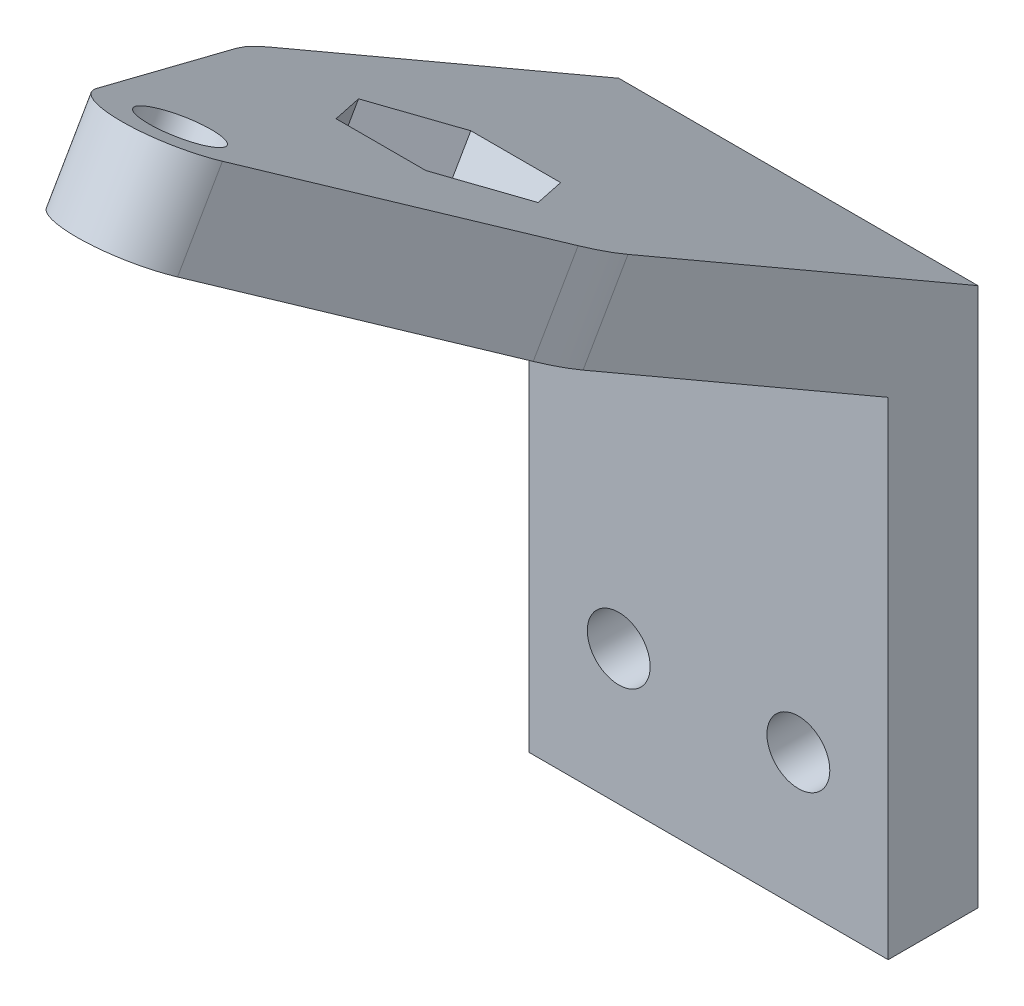
ISO-10303-21;
HEADER;
FILE_DESCRIPTION(('STEP AP214'),'2;1');
FILE_NAME('part.step','',(''),(''),'','','');
FILE_SCHEMA(('AUTOMOTIVE_DESIGN { 1 0 10303 214 1 1 1 1 }'));
ENDSEC;
DATA;
#1=APPLICATION_CONTEXT('core data for automotive mechanical design processes');
#2=APPLICATION_PROTOCOL_DEFINITION('international standard','automotive_design',2000,#1);
#3=PRODUCT_CONTEXT('',#1,'mechanical');
#4=PRODUCT('Part','Part','',(#3));
#5=PRODUCT_RELATED_PRODUCT_CATEGORY('part','',(#4));
#6=PRODUCT_DEFINITION_FORMATION('','',#4);
#7=PRODUCT_DEFINITION_CONTEXT('part definition',#1,'design');
#8=PRODUCT_DEFINITION('design','',#6,#7);
#9=PRODUCT_DEFINITION_SHAPE('','',#8);
#10=(LENGTH_UNIT() NAMED_UNIT(*) SI_UNIT(.MILLI.,.METRE.));
#11=(NAMED_UNIT(*) PLANE_ANGLE_UNIT() SI_UNIT($,.RADIAN.));
#12=(NAMED_UNIT(*) SI_UNIT($,.STERADIAN.) SOLID_ANGLE_UNIT());
#13=UNCERTAINTY_MEASURE_WITH_UNIT(LENGTH_MEASURE(1.E-05),#10,'distance_accuracy_value','');
#14=(GEOMETRIC_REPRESENTATION_CONTEXT(3) GLOBAL_UNCERTAINTY_ASSIGNED_CONTEXT((#13)) GLOBAL_UNIT_ASSIGNED_CONTEXT((#10,
#11,#12)) REPRESENTATION_CONTEXT('',''));
#15=CARTESIAN_POINT('',(0.,0.,0.));
#16=DIRECTION('',(0.,0.,1.));
#17=DIRECTION('',(1.,0.,0.));
#18=AXIS2_PLACEMENT_3D('',#15,#16,#17);
#19=CARTESIAN_POINT('',(-20.,0.,0.));
#20=DIRECTION('',(-1.,0.,0.));
#21=DIRECTION('',(0.,0.,1.));
#22=AXIS2_PLACEMENT_3D('',#19,#20,#21);
#23=PLANE('',#22);
#24=DIRECTION('',(0.,0.499999999999998,0.86602540378444));
#25=VECTOR('',#24,1.);
#26=CARTESIAN_POINT('',(-20.,-8.6602540378444,4.99999999999998));
#27=LINE('',#26,#25);
#28=CARTESIAN_POINT('',(-20.,-5.77350269189627,10.));
#29=VERTEX_POINT('',#28);
#30=CARTESIAN_POINT('',(-20.,13.8397459621555,43.9711431702998));
#31=VERTEX_POINT('',#30);
#32=EDGE_CURVE('E273',#29,#31,#27,.T.);
#33=ORIENTED_EDGE('',*,*,#32,.T.);
#34=DIRECTION('',(0.,0.86602540378444,-0.499999999999998));
#35=VECTOR('',#34,1.);
#36=CARTESIAN_POINT('',(-20.,13.8397459621555,43.9711431702998));
#37=LINE('',#36,#35);
#38=CARTESIAN_POINT('',(-20.,22.4999999999999,38.9711431702998));
#39=VERTEX_POINT('',#38);
#40=EDGE_CURVE('E229',#31,#39,#37,.T.);
#41=ORIENTED_EDGE('',*,*,#40,.T.);
#42=DIRECTION('',(0.,0.499999999999998,0.86602540378444));
#43=VECTOR('',#42,1.);
#44=CARTESIAN_POINT('',(-20.,0.,0.));
#45=LINE('',#44,#43);
#46=CARTESIAN_POINT('',(-20.,0.,0.));
#47=VERTEX_POINT('',#46);
#48=EDGE_CURVE('E246',#47,#39,#45,.T.);
#49=ORIENTED_EDGE('',*,*,#48,.F.);
#50=DIRECTION('',(0.,1.,0.));
#51=VECTOR('',#50,1.);
#52=CARTESIAN_POINT('',(-20.,-60.,0.));
#53=LINE('',#52,#51);
#54=CARTESIAN_POINT('',(-20.,-60.,0.));
#55=VERTEX_POINT('',#54);
#56=EDGE_CURVE('E259',#55,#47,#53,.T.);
#57=ORIENTED_EDGE('',*,*,#56,.F.);
#58=DIRECTION('',(0.,0.,1.));
#59=VECTOR('',#58,1.);
#60=CARTESIAN_POINT('',(-20.,-60.,0.));
#61=LINE('',#60,#59);
#62=CARTESIAN_POINT('',(-20.,-60.,10.));
#63=VERTEX_POINT('',#62);
#64=EDGE_CURVE('E279',#55,#63,#61,.T.);
#65=ORIENTED_EDGE('',*,*,#64,.T.);
#66=DIRECTION('',(0.,1.,0.));
#67=VECTOR('',#66,1.);
#68=CARTESIAN_POINT('',(-20.,-60.,10.));
#69=LINE('',#68,#67);
#70=EDGE_CURVE('E276',#63,#29,#69,.T.);
#71=ORIENTED_EDGE('',*,*,#70,.T.);
#72=EDGE_LOOP('',(#33,#41,#49,#57,#65,#71));
#73=FACE_BOUND('',#72,.T.);
#74=ADVANCED_FACE('F33',(#73),#23,.T.);
#75=CARTESIAN_POINT('',(20.,0.,0.));
#76=DIRECTION('',(0.,-0.86602540378444,0.499999999999998));
#77=DIRECTION('',(0.,-0.499999999999998,-0.86602540378444));
#78=AXIS2_PLACEMENT_3D('',#75,#76,#77);
#79=PLANE('',#78);
#80=CARTESIAN_POINT('',(0.,39.7499999999998,68.8490196008628));
#81=DIRECTION('',(0.,0.86602540378444,-0.499999999999998));
#82=DIRECTION('',(0.,0.499999999999998,0.86602540378444));
#83=AXIS2_PLACEMENT_3D('',#80,#81,#82);
#84=CIRCLE('',#83,4.);
#85=CARTESIAN_POINT('',(0.,41.7499999999998,72.3131212160006));
#86=VERTEX_POINT('',#85);
#87=EDGE_CURVE('E170',#86,#86,#84,.T.);
#88=ORIENTED_EDGE('',*,*,#87,.F.);
#89=EDGE_LOOP('',(#88));
#90=FACE_BOUND('',#89,.T.);
#91=DIRECTION('',(-0.5,-0.433012701892218,-0.750000000000001));
#92=VECTOR('',#91,1.);
#93=CARTESIAN_POINT('',(10.,22.4999999999999,38.9711431702998));
#94=LINE('',#93,#92);
#95=CARTESIAN_POINT('',(10.,22.4999999999999,38.9711431702998));
#96=VERTEX_POINT('',#95);
#97=CARTESIAN_POINT('',(5.00000000000001,18.1698729810777,31.4711431702998));
#98=VERTEX_POINT('',#97);
#99=EDGE_CURVE('E181',#96,#98,#94,.T.);
#100=ORIENTED_EDGE('',*,*,#99,.F.);
#101=DIRECTION('',(0.499999999999999,-0.433012701892218,-0.750000000000002));
#102=VECTOR('',#101,1.);
#103=CARTESIAN_POINT('',(5.00000000000002,26.8301270189221,46.4711431702998));
#104=LINE('',#103,#102);
#105=CARTESIAN_POINT('',(5.00000000000002,26.8301270189221,46.4711431702998));
#106=VERTEX_POINT('',#105);
#107=EDGE_CURVE('E48',#106,#96,#104,.T.);
#108=ORIENTED_EDGE('',*,*,#107,.F.);
#109=DIRECTION('',(1.,0.,0.));
#110=VECTOR('',#109,1.);
#111=CARTESIAN_POINT('',(-5.,26.8301270189221,46.4711431702998));
#112=LINE('',#111,#110);
#113=CARTESIAN_POINT('',(-5.,26.8301270189221,46.4711431702998));
#114=VERTEX_POINT('',#113);
#115=EDGE_CURVE('E164',#114,#106,#112,.T.);
#116=ORIENTED_EDGE('',*,*,#115,.F.);
#117=DIRECTION('',(0.5,0.433012701892218,0.750000000000001));
#118=VECTOR('',#117,1.);
#119=CARTESIAN_POINT('',(-10.,22.4999999999999,38.9711431702998));
#120=LINE('',#119,#118);
#121=CARTESIAN_POINT('',(-10.,22.4999999999999,38.9711431702998));
#122=VERTEX_POINT('',#121);
#123=EDGE_CURVE('E167',#122,#114,#120,.T.);
#124=ORIENTED_EDGE('',*,*,#123,.F.);
#125=DIRECTION('',(-0.5,0.433012701892218,0.750000000000001));
#126=VECTOR('',#125,1.);
#127=CARTESIAN_POINT('',(-5.00000000000001,18.1698729810777,31.4711431702998));
#128=LINE('',#127,#126);
#129=CARTESIAN_POINT('',(-5.00000000000001,18.1698729810777,31.4711431702998));
#130=VERTEX_POINT('',#129);
#131=EDGE_CURVE('E186',#130,#122,#128,.T.);
#132=ORIENTED_EDGE('',*,*,#131,.F.);
#133=DIRECTION('',(-1.,0.,0.));
#134=VECTOR('',#133,1.);
#135=CARTESIAN_POINT('',(5.00000000000001,18.1698729810777,31.4711431702998));
#136=LINE('',#135,#134);
#137=EDGE_CURVE('E183',#98,#130,#136,.T.);
#138=ORIENTED_EDGE('',*,*,#137,.F.);
#139=EDGE_LOOP('',(#100,#108,#116,#124,#132,#138));
#140=FACE_BOUND('',#139,.T.);
#141=CARTESIAN_POINT('',(-5.,22.4999999999999,38.9711431702998));
#142=DIRECTION('',(0.,0.86602540378444,-0.499999999999998));
#143=DIRECTION('',(0.,0.499999999999998,0.86602540378444));
#144=AXIS2_PLACEMENT_3D('',#141,#142,#143);
#145=CIRCLE('',#144,15.);
#146=CARTESIAN_POINT('',(-19.0344094541193,25.1474209749361,43.5566108079128));
#147=VERTEX_POINT('',#146);
#148=EDGE_CURVE('E204',#39,#147,#145,.T.);
#149=ORIENTED_EDGE('',*,*,#148,.T.);
#150=DIRECTION('',(0.352989463324824,0.46781364847064,0.810277007625319));
#151=VECTOR('',#150,1.);
#152=CARTESIAN_POINT('',(-33.2733976318987,6.27662254589737,10.8714291494266));
#153=LINE('',#152,#151);
#154=CARTESIAN_POINT('',(-7.01720472705962,41.0737104874679,71.1417534196695));
#155=VERTEX_POINT('',#154);
#156=EDGE_CURVE('E224',#147,#155,#153,.T.);
#157=ORIENTED_EDGE('',*,*,#156,.T.);
#158=CARTESIAN_POINT('',(0.,39.7499999999998,68.8490196008628));
#159=DIRECTION('',(0.,0.86602540378444,-0.499999999999998));
#160=DIRECTION('',(0.,0.499999999999998,0.86602540378444));
#161=AXIS2_PLACEMENT_3D('',#158,#159,#160);
#162=CIRCLE('',#161,7.50000000000004);
#163=CARTESIAN_POINT('',(7.01720472705962,41.0737104874679,71.1417534196695));
#164=VERTEX_POINT('',#163);
#165=EDGE_CURVE('E222',#155,#164,#162,.T.);
#166=ORIENTED_EDGE('',*,*,#165,.T.);
#167=DIRECTION('',(-0.352989463324824,0.46781364847064,0.810277007625319));
#168=VECTOR('',#167,1.);
#169=CARTESIAN_POINT('',(33.2733976318987,6.27662254589737,10.8714291494266));
#170=LINE('',#169,#168);
#171=CARTESIAN_POINT('',(19.0344094541193,25.1474209749361,43.5566108079128));
#172=VERTEX_POINT('',#171);
#173=EDGE_CURVE('E218',#172,#164,#170,.T.);
#174=ORIENTED_EDGE('',*,*,#173,.F.);
#175=CARTESIAN_POINT('',(5.,22.4999999999999,38.9711431702998));
#176=DIRECTION('',(0.,0.86602540378444,-0.499999999999998));
#177=DIRECTION('',(0.,0.499999999999998,0.86602540378444));
#178=AXIS2_PLACEMENT_3D('',#175,#176,#177);
#179=CIRCLE('',#178,15.);
#180=CARTESIAN_POINT('',(20.,22.4999999999999,38.9711431702998));
#181=VERTEX_POINT('',#180);
#182=EDGE_CURVE('E215',#181,#172,#179,.F.);
#183=ORIENTED_EDGE('',*,*,#182,.F.);
#184=DIRECTION('',(0.,0.499999999999998,0.86602540378444));
#185=VECTOR('',#184,1.);
#186=CARTESIAN_POINT('',(20.,0.,0.));
#187=LINE('',#186,#185);
#188=CARTESIAN_POINT('',(20.,0.,0.));
#189=VERTEX_POINT('',#188);
#190=EDGE_CURVE('E255',#189,#181,#187,.T.);
#191=ORIENTED_EDGE('',*,*,#190,.F.);
#192=DIRECTION('',(-1.,0.,0.));
#193=VECTOR('',#192,1.);
#194=CARTESIAN_POINT('',(20.,0.,0.));
#195=LINE('',#194,#193);
#196=EDGE_CURVE('E270',#189,#47,#195,.T.);
#197=ORIENTED_EDGE('',*,*,#196,.T.);
#198=ORIENTED_EDGE('',*,*,#48,.T.);
#199=EDGE_LOOP('',(#149,#157,#166,#174,#183,#191,#197,#198));
#200=FACE_BOUND('',#199,.T.);
#201=ADVANCED_FACE('F35',(#90,#140,#200),#79,.F.);
#202=CARTESIAN_POINT('',(20.,-8.6602540378444,4.99999999999998));
#203=DIRECTION('',(0.,-0.86602540378444,0.499999999999998));
#204=DIRECTION('',(0.,-0.499999999999998,-0.86602540378444));
#205=AXIS2_PLACEMENT_3D('',#202,#203,#204);
#206=PLANE('',#205);
#207=CARTESIAN_POINT('',(0.,31.0897459621554,73.8490196008628));
#208=DIRECTION('',(0.,0.86602540378444,-0.499999999999998));
#209=DIRECTION('',(0.,0.499999999999998,0.86602540378444));
#210=AXIS2_PLACEMENT_3D('',#207,#208,#209);
#211=CIRCLE('',#210,4.);
#212=CARTESIAN_POINT('',(0.,33.0897459621554,77.3131212160006));
#213=VERTEX_POINT('',#212);
#214=EDGE_CURVE('E219',#213,#213,#211,.T.);
#215=ORIENTED_EDGE('',*,*,#214,.T.);
#216=EDGE_LOOP('',(#215));
#217=FACE_BOUND('',#216,.T.);
#218=DIRECTION('',(0.499999999999999,-0.433012701892218,-0.750000000000002));
#219=VECTOR('',#218,1.);
#220=CARTESIAN_POINT('',(5.00000000000002,18.1698729810777,51.4711431702998));
#221=LINE('',#220,#219);
#222=CARTESIAN_POINT('',(5.00000000000002,18.1698729810777,51.4711431702998));
#223=VERTEX_POINT('',#222);
#224=CARTESIAN_POINT('',(10.,13.8397459621555,43.9711431702998));
#225=VERTEX_POINT('',#224);
#226=EDGE_CURVE('E147',#223,#225,#221,.T.);
#227=ORIENTED_EDGE('',*,*,#226,.T.);
#228=DIRECTION('',(-0.5,-0.433012701892218,-0.750000000000001));
#229=VECTOR('',#228,1.);
#230=CARTESIAN_POINT('',(10.,13.8397459621555,43.9711431702998));
#231=LINE('',#230,#229);
#232=CARTESIAN_POINT('',(5.00000000000001,9.50961894323332,36.4711431702997));
#233=VERTEX_POINT('',#232);
#234=EDGE_CURVE('E156',#225,#233,#231,.T.);
#235=ORIENTED_EDGE('',*,*,#234,.T.);
#236=DIRECTION('',(-1.,0.,0.));
#237=VECTOR('',#236,1.);
#238=CARTESIAN_POINT('',(5.00000000000001,9.50961894323333,36.4711431702997));
#239=LINE('',#238,#237);
#240=CARTESIAN_POINT('',(-5.00000000000001,9.50961894323333,36.4711431702997));
#241=VERTEX_POINT('',#240);
#242=EDGE_CURVE('E56',#233,#241,#239,.T.);
#243=ORIENTED_EDGE('',*,*,#242,.T.);
#244=DIRECTION('',(-0.5,0.433012701892218,0.750000000000001));
#245=VECTOR('',#244,1.);
#246=CARTESIAN_POINT('',(-5.00000000000001,9.50961894323333,36.4711431702997));
#247=LINE('',#246,#245);
#248=CARTESIAN_POINT('',(-10.,13.8397459621555,43.9711431702998));
#249=VERTEX_POINT('',#248);
#250=EDGE_CURVE('E174',#241,#249,#247,.T.);
#251=ORIENTED_EDGE('',*,*,#250,.T.);
#252=DIRECTION('',(0.5,0.433012701892218,0.750000000000001));
#253=VECTOR('',#252,1.);
#254=CARTESIAN_POINT('',(-10.,13.8397459621555,43.9711431702998));
#255=LINE('',#254,#253);
#256=CARTESIAN_POINT('',(-5.,18.1698729810777,51.4711431702998));
#257=VERTEX_POINT('',#256);
#258=EDGE_CURVE('E177',#249,#257,#255,.T.);
#259=ORIENTED_EDGE('',*,*,#258,.T.);
#260=DIRECTION('',(1.,0.,0.));
#261=VECTOR('',#260,1.);
#262=CARTESIAN_POINT('',(-5.,18.1698729810777,51.4711431702998));
#263=LINE('',#262,#261);
#264=EDGE_CURVE('E153',#257,#223,#263,.T.);
#265=ORIENTED_EDGE('',*,*,#264,.T.);
#266=EDGE_LOOP('',(#227,#235,#243,#251,#259,#265));
#267=FACE_BOUND('',#266,.T.);
#268=DIRECTION('',(0.352989463324824,0.46781364847064,0.810277007625319));
#269=VECTOR('',#268,1.);
#270=CARTESIAN_POINT('',(-33.2733976318987,-2.38363149194703,15.8714291494266));
#271=LINE('',#270,#269);
#272=CARTESIAN_POINT('',(-19.0344094541193,16.4871669370917,48.5566108079128));
#273=VERTEX_POINT('',#272);
#274=CARTESIAN_POINT('',(-7.01720472705962,32.4134564496235,76.1417534196695));
#275=VERTEX_POINT('',#274);
#276=EDGE_CURVE('E209',#273,#275,#271,.T.);
#277=ORIENTED_EDGE('',*,*,#276,.F.);
#278=CARTESIAN_POINT('',(-5.,13.8397459621555,43.9711431702998));
#279=DIRECTION('',(0.,0.86602540378444,-0.499999999999998));
#280=DIRECTION('',(0.,0.499999999999998,0.86602540378444));
#281=AXIS2_PLACEMENT_3D('',#278,#279,#280);
#282=CIRCLE('',#281,15.);
#283=EDGE_CURVE('E212',#31,#273,#282,.T.);
#284=ORIENTED_EDGE('',*,*,#283,.F.);
#285=ORIENTED_EDGE('',*,*,#32,.F.);
#286=DIRECTION('',(-1.,0.,0.));
#287=VECTOR('',#286,1.);
#288=CARTESIAN_POINT('',(20.,-5.77350269189627,10.));
#289=LINE('',#288,#287);
#290=CARTESIAN_POINT('',(20.,-5.77350269189627,10.));
#291=VERTEX_POINT('',#290);
#292=EDGE_CURVE('E11',#291,#29,#289,.T.);
#293=ORIENTED_EDGE('',*,*,#292,.F.);
#294=DIRECTION('',(0.,0.499999999999998,0.86602540378444));
#295=VECTOR('',#294,1.);
#296=CARTESIAN_POINT('',(20.,-8.6602540378444,4.99999999999998));
#297=LINE('',#296,#295);
#298=CARTESIAN_POINT('',(20.,13.8397459621555,43.9711431702998));
#299=VERTEX_POINT('',#298);
#300=EDGE_CURVE('E258',#291,#299,#297,.T.);
#301=ORIENTED_EDGE('',*,*,#300,.T.);
#302=CARTESIAN_POINT('',(5.,13.8397459621555,43.9711431702998));
#303=DIRECTION('',(0.,0.86602540378444,-0.499999999999998));
#304=DIRECTION('',(0.,0.499999999999998,0.86602540378444));
#305=AXIS2_PLACEMENT_3D('',#302,#303,#304);
#306=CIRCLE('',#305,15.);
#307=CARTESIAN_POINT('',(19.0344094541193,16.4871669370917,48.5566108079128));
#308=VERTEX_POINT('',#307);
#309=EDGE_CURVE('E200',#299,#308,#306,.F.);
#310=ORIENTED_EDGE('',*,*,#309,.T.);
#311=DIRECTION('',(-0.352989463324824,0.46781364847064,0.810277007625319));
#312=VECTOR('',#311,1.);
#313=CARTESIAN_POINT('',(33.2733976318987,-2.38363149194703,15.8714291494266));
#314=LINE('',#313,#312);
#315=CARTESIAN_POINT('',(7.01720472705962,32.4134564496235,76.1417534196695));
#316=VERTEX_POINT('',#315);
#317=EDGE_CURVE('E203',#308,#316,#314,.T.);
#318=ORIENTED_EDGE('',*,*,#317,.T.);
#319=CARTESIAN_POINT('',(0.,31.0897459621554,73.8490196008628));
#320=DIRECTION('',(0.,0.86602540378444,-0.499999999999998));
#321=DIRECTION('',(0.,0.499999999999998,0.86602540378444));
#322=AXIS2_PLACEMENT_3D('',#319,#320,#321);
#323=CIRCLE('',#322,7.50000000000004);
#324=EDGE_CURVE('E207',#275,#316,#323,.T.);
#325=ORIENTED_EDGE('',*,*,#324,.F.);
#326=EDGE_LOOP('',(#277,#284,#285,#293,#301,#310,#318,#325));
#327=FACE_BOUND('',#326,.T.);
#328=ADVANCED_FACE('F160',(#217,#267,#327),#206,.T.);
#329=CARTESIAN_POINT('',(20.,-60.,10.));
#330=DIRECTION('',(0.,0.,1.));
#331=DIRECTION('',(1.,0.,0.));
#332=AXIS2_PLACEMENT_3D('',#329,#330,#331);
#333=PLANE('',#332);
#334=CARTESIAN_POINT('',(10.,-45.,9.99999999999999));
#335=DIRECTION('',(0.,0.,1.));
#336=DIRECTION('',(1.,0.,0.));
#337=AXIS2_PLACEMENT_3D('',#334,#335,#336);
#338=CIRCLE('',#337,3.5);
#339=CARTESIAN_POINT('',(13.5,-45.,9.99999999999999));
#340=VERTEX_POINT('',#339);
#341=EDGE_CURVE('E247',#340,#340,#338,.F.);
#342=ORIENTED_EDGE('',*,*,#341,.T.);
#343=EDGE_LOOP('',(#342));
#344=FACE_BOUND('',#343,.T.);
#345=CARTESIAN_POINT('',(-10.,-45.,9.99999999999999));
#346=DIRECTION('',(0.,0.,1.));
#347=DIRECTION('',(1.,0.,0.));
#348=AXIS2_PLACEMENT_3D('',#345,#346,#347);
#349=CIRCLE('',#348,3.5);
#350=CARTESIAN_POINT('',(-6.5,-45.,9.99999999999999));
#351=VERTEX_POINT('',#350);
#352=EDGE_CURVE('E232',#351,#351,#349,.F.);
#353=ORIENTED_EDGE('',*,*,#352,.T.);
#354=EDGE_LOOP('',(#353));
#355=FACE_BOUND('',#354,.T.);
#356=ORIENTED_EDGE('',*,*,#70,.F.);
#357=DIRECTION('',(-1.,0.,0.));
#358=VECTOR('',#357,1.);
#359=CARTESIAN_POINT('',(20.,-60.,10.));
#360=LINE('',#359,#358);
#361=CARTESIAN_POINT('',(20.,-60.,10.));
#362=VERTEX_POINT('',#361);
#363=EDGE_CURVE('E41',#362,#63,#360,.T.);
#364=ORIENTED_EDGE('',*,*,#363,.F.);
#365=DIRECTION('',(0.,1.,0.));
#366=VECTOR('',#365,1.);
#367=CARTESIAN_POINT('',(20.,-60.,10.));
#368=LINE('',#367,#366);
#369=EDGE_CURVE('E262',#362,#291,#368,.T.);
#370=ORIENTED_EDGE('',*,*,#369,.T.);
#371=ORIENTED_EDGE('',*,*,#292,.T.);
#372=EDGE_LOOP('',(#356,#364,#370,#371));
#373=FACE_BOUND('',#372,.T.);
#374=ADVANCED_FACE('F293',(#344,#355,#373),#333,.T.);
#375=CARTESIAN_POINT('',(20.,-60.,0.));
#376=DIRECTION('',(0.,-1.,0.));
#377=DIRECTION('',(0.,0.,-1.));
#378=AXIS2_PLACEMENT_3D('',#375,#376,#377);
#379=PLANE('',#378);
#380=ORIENTED_EDGE('',*,*,#64,.F.);
#381=DIRECTION('',(-1.,0.,0.));
#382=VECTOR('',#381,1.);
#383=CARTESIAN_POINT('',(20.,-60.,0.));
#384=LINE('',#383,#382);
#385=CARTESIAN_POINT('',(20.,-60.,0.));
#386=VERTEX_POINT('',#385);
#387=EDGE_CURVE('E285',#386,#55,#384,.T.);
#388=ORIENTED_EDGE('',*,*,#387,.F.);
#389=DIRECTION('',(0.,0.,1.));
#390=VECTOR('',#389,1.);
#391=CARTESIAN_POINT('',(20.,-60.,0.));
#392=LINE('',#391,#390);
#393=EDGE_CURVE('E265',#386,#362,#392,.T.);
#394=ORIENTED_EDGE('',*,*,#393,.T.);
#395=ORIENTED_EDGE('',*,*,#363,.T.);
#396=EDGE_LOOP('',(#380,#388,#394,#395));
#397=FACE_BOUND('',#396,.T.);
#398=ADVANCED_FACE('F289',(#397),#379,.T.);
#399=CARTESIAN_POINT('',(20.,-60.,0.));
#400=DIRECTION('',(0.,0.,1.));
#401=DIRECTION('',(1.,0.,0.));
#402=AXIS2_PLACEMENT_3D('',#399,#400,#401);
#403=PLANE('',#402);
#404=CARTESIAN_POINT('',(10.,-45.,0.));
#405=DIRECTION('',(0.,0.,-1.));
#406=DIRECTION('',(-1.,0.,0.));
#407=AXIS2_PLACEMENT_3D('',#404,#405,#406);
#408=CIRCLE('',#407,3.5);
#409=CARTESIAN_POINT('',(6.5,-45.,0.));
#410=VERTEX_POINT('',#409);
#411=EDGE_CURVE('E243',#410,#410,#408,.T.);
#412=ORIENTED_EDGE('',*,*,#411,.F.);
#413=EDGE_LOOP('',(#412));
#414=FACE_BOUND('',#413,.T.);
#415=CARTESIAN_POINT('',(-10.,-45.,0.));
#416=DIRECTION('',(0.,0.,-1.));
#417=DIRECTION('',(1.,0.,0.));
#418=AXIS2_PLACEMENT_3D('',#415,#416,#417);
#419=CIRCLE('',#418,3.5);
#420=CARTESIAN_POINT('',(-6.5,-45.,0.));
#421=VERTEX_POINT('',#420);
#422=EDGE_CURVE('E250',#421,#421,#419,.T.);
#423=ORIENTED_EDGE('',*,*,#422,.F.);
#424=EDGE_LOOP('',(#423));
#425=FACE_BOUND('',#424,.T.);
#426=ORIENTED_EDGE('',*,*,#56,.T.);
#427=ORIENTED_EDGE('',*,*,#196,.F.);
#428=DIRECTION('',(0.,1.,0.));
#429=VECTOR('',#428,1.);
#430=CARTESIAN_POINT('',(20.,-60.,0.));
#431=LINE('',#430,#429);
#432=EDGE_CURVE('E268',#386,#189,#431,.T.);
#433=ORIENTED_EDGE('',*,*,#432,.F.);
#434=ORIENTED_EDGE('',*,*,#387,.T.);
#435=EDGE_LOOP('',(#426,#427,#433,#434));
#436=FACE_BOUND('',#435,.T.);
#437=ADVANCED_FACE('F300',(#414,#425,#436),#403,.F.);
#438=CARTESIAN_POINT('',(20.,0.,0.));
#439=DIRECTION('',(-1.,0.,0.));
#440=DIRECTION('',(0.,0.,1.));
#441=AXIS2_PLACEMENT_3D('',#438,#439,#440);
#442=PLANE('',#441);
#443=ORIENTED_EDGE('',*,*,#190,.T.);
#444=DIRECTION('',(0.,0.86602540378444,-0.499999999999998));
#445=VECTOR('',#444,1.);
#446=CARTESIAN_POINT('',(20.,13.8397459621555,43.9711431702998));
#447=LINE('',#446,#445);
#448=EDGE_CURVE('E214',#299,#181,#447,.T.);
#449=ORIENTED_EDGE('',*,*,#448,.F.);
#450=ORIENTED_EDGE('',*,*,#300,.F.);
#451=ORIENTED_EDGE('',*,*,#369,.F.);
#452=ORIENTED_EDGE('',*,*,#393,.F.);
#453=ORIENTED_EDGE('',*,*,#432,.T.);
#454=EDGE_LOOP('',(#443,#449,#450,#451,#452,#453));
#455=FACE_BOUND('',#454,.T.);
#456=ADVANCED_FACE('F308',(#455),#442,.F.);
#457=CARTESIAN_POINT('',(-10.,-45.,80.3452101292463));
#458=DIRECTION('',(0.,0.,-1.));
#459=DIRECTION('',(-1.,0.,0.));
#460=AXIS2_PLACEMENT_3D('',#457,#458,#459);
#461=CYLINDRICAL_SURFACE('',#460,3.5);
#462=ORIENTED_EDGE('',*,*,#352,.F.);
#463=EDGE_LOOP('',(#462));
#464=FACE_BOUND('',#463,.T.);
#465=ORIENTED_EDGE('',*,*,#422,.T.);
#466=EDGE_LOOP('',(#465));
#467=FACE_BOUND('',#466,.T.);
#468=ADVANCED_FACE('F401',(#464,#467),#461,.F.);
#469=CARTESIAN_POINT('',(10.,-45.,80.3452101292463));
#470=DIRECTION('',(0.,0.,-1.));
#471=DIRECTION('',(-1.,0.,0.));
#472=AXIS2_PLACEMENT_3D('',#469,#470,#471);
#473=CYLINDRICAL_SURFACE('',#472,3.5);
#474=ORIENTED_EDGE('',*,*,#341,.F.);
#475=EDGE_LOOP('',(#474));
#476=FACE_BOUND('',#475,.T.);
#477=ORIENTED_EDGE('',*,*,#411,.T.);
#478=EDGE_LOOP('',(#477));
#479=FACE_BOUND('',#478,.T.);
#480=ADVANCED_FACE('F397',(#476,#479),#473,.F.);
#481=CARTESIAN_POINT('',(0.,31.0897459621554,73.8490196008628));
#482=DIRECTION('',(0.,0.86602540378444,-0.499999999999998));
#483=DIRECTION('',(0.,0.499999999999998,0.86602540378444));
#484=AXIS2_PLACEMENT_3D('',#481,#482,#483);
#485=CYLINDRICAL_SURFACE('',#484,7.50000000000004);
#486=DIRECTION('',(0.,0.86602540378444,-0.499999999999998));
#487=VECTOR('',#486,1.);
#488=CARTESIAN_POINT('',(-7.01720472705962,32.4134564496235,76.1417534196695));
#489=LINE('',#488,#487);
#490=EDGE_CURVE('E235',#275,#155,#489,.T.);
#491=ORIENTED_EDGE('',*,*,#490,.F.);
#492=ORIENTED_EDGE('',*,*,#324,.T.);
#493=DIRECTION('',(0.,0.86602540378444,-0.499999999999998));
#494=VECTOR('',#493,1.);
#495=CARTESIAN_POINT('',(7.01720472705962,32.4134564496235,76.1417534196695));
#496=LINE('',#495,#494);
#497=EDGE_CURVE('E237',#316,#164,#496,.T.);
#498=ORIENTED_EDGE('',*,*,#497,.T.);
#499=ORIENTED_EDGE('',*,*,#165,.F.);
#500=EDGE_LOOP('',(#491,#492,#498,#499));
#501=FACE_BOUND('',#500,.T.);
#502=ADVANCED_FACE('F321',(#501),#485,.T.);
#503=CARTESIAN_POINT('',(-5.,13.8397459621555,43.9711431702998));
#504=DIRECTION('',(0.,0.86602540378444,-0.499999999999998));
#505=DIRECTION('',(0.,0.499999999999998,0.86602540378444));
#506=AXIS2_PLACEMENT_3D('',#503,#504,#505);
#507=CYLINDRICAL_SURFACE('',#506,15.);
#508=ORIENTED_EDGE('',*,*,#148,.F.);
#509=ORIENTED_EDGE('',*,*,#40,.F.);
#510=ORIENTED_EDGE('',*,*,#283,.T.);
#511=DIRECTION('',(0.,0.86602540378444,-0.499999999999998));
#512=VECTOR('',#511,1.);
#513=CARTESIAN_POINT('',(-19.0344094541193,16.4871669370917,48.5566108079128));
#514=LINE('',#513,#512);
#515=EDGE_CURVE('E233',#273,#147,#514,.T.);
#516=ORIENTED_EDGE('',*,*,#515,.T.);
#517=EDGE_LOOP('',(#508,#509,#510,#516));
#518=FACE_BOUND('',#517,.T.);
#519=ADVANCED_FACE('F313',(#518),#507,.T.);
#520=CARTESIAN_POINT('',(-33.2733976318987,-2.38363149194703,15.8714291494266));
#521=DIRECTION('',(-0.935627296941284,0.176494731662411,0.305697842507533));
#522=DIRECTION('',(0.310573351959426,0.,0.950549416418045));
#523=AXIS2_PLACEMENT_3D('',#520,#521,#522);
#524=PLANE('',#523);
#525=ORIENTED_EDGE('',*,*,#156,.F.);
#526=ORIENTED_EDGE('',*,*,#515,.F.);
#527=ORIENTED_EDGE('',*,*,#276,.T.);
#528=ORIENTED_EDGE('',*,*,#490,.T.);
#529=EDGE_LOOP('',(#525,#526,#527,#528));
#530=FACE_BOUND('',#529,.T.);
#531=ADVANCED_FACE('F318',(#530),#524,.T.);
#532=CARTESIAN_POINT('',(33.2733976318987,-2.38363149194703,15.8714291494266));
#533=DIRECTION('',(-0.935627296941284,-0.176494731662411,-0.305697842507533));
#534=DIRECTION('',(-0.310573351959426,0.,0.950549416418045));
#535=AXIS2_PLACEMENT_3D('',#532,#533,#534);
#536=PLANE('',#535);
#537=ORIENTED_EDGE('',*,*,#173,.T.);
#538=ORIENTED_EDGE('',*,*,#497,.F.);
#539=ORIENTED_EDGE('',*,*,#317,.F.);
#540=DIRECTION('',(0.,0.86602540378444,-0.499999999999998));
#541=VECTOR('',#540,1.);
#542=CARTESIAN_POINT('',(19.0344094541193,16.4871669370917,48.5566108079128));
#543=LINE('',#542,#541);
#544=EDGE_CURVE('E240',#308,#172,#543,.T.);
#545=ORIENTED_EDGE('',*,*,#544,.T.);
#546=EDGE_LOOP('',(#537,#538,#539,#545));
#547=FACE_BOUND('',#546,.T.);
#548=ADVANCED_FACE('F325',(#547),#536,.F.);
#549=CARTESIAN_POINT('',(5.,13.8397459621555,43.9711431702998));
#550=DIRECTION('',(0.,0.86602540378444,-0.499999999999998));
#551=DIRECTION('',(0.,0.499999999999998,0.86602540378444));
#552=AXIS2_PLACEMENT_3D('',#549,#550,#551);
#553=CYLINDRICAL_SURFACE('',#552,15.);
#554=ORIENTED_EDGE('',*,*,#182,.T.);
#555=ORIENTED_EDGE('',*,*,#544,.F.);
#556=ORIENTED_EDGE('',*,*,#309,.F.);
#557=ORIENTED_EDGE('',*,*,#448,.T.);
#558=EDGE_LOOP('',(#554,#555,#556,#557));
#559=FACE_BOUND('',#558,.T.);
#560=ADVANCED_FACE('F327',(#559),#553,.T.);
#561=CARTESIAN_POINT('',(5.00000000000002,18.1698729810777,51.4711431702998));
#562=DIRECTION('',(0.866025403784439,0.249999999999999,0.433012701892219));
#563=DIRECTION('',(0.447213595499958,0.,-0.894427190999916));
#564=AXIS2_PLACEMENT_3D('',#561,#562,#563);
#565=PLANE('',#564);
#566=ORIENTED_EDGE('',*,*,#107,.T.);
#567=DIRECTION('',(0.,0.86602540378444,-0.499999999999998));
#568=VECTOR('',#567,1.);
#569=CARTESIAN_POINT('',(10.,13.8397459621555,43.9711431702998));
#570=LINE('',#569,#568);
#571=EDGE_CURVE('E143',#225,#96,#570,.T.);
#572=ORIENTED_EDGE('',*,*,#571,.F.);
#573=ORIENTED_EDGE('',*,*,#226,.F.);
#574=DIRECTION('',(0.,0.86602540378444,-0.499999999999998));
#575=VECTOR('',#574,1.);
#576=CARTESIAN_POINT('',(5.00000000000002,18.1698729810777,51.4711431702998));
#577=LINE('',#576,#575);
#578=EDGE_CURVE('E191',#223,#106,#577,.T.);
#579=ORIENTED_EDGE('',*,*,#578,.T.);
#580=EDGE_LOOP('',(#566,#572,#573,#579));
#581=FACE_BOUND('',#580,.T.);
#582=ADVANCED_FACE('F145',(#581),#565,.F.);
#583=CARTESIAN_POINT('',(-5.,18.1698729810777,51.4711431702998));
#584=DIRECTION('',(0.,0.499999999999998,0.86602540378444));
#585=DIRECTION('',(0.,-0.86602540378444,0.499999999999998));
#586=AXIS2_PLACEMENT_3D('',#583,#584,#585);
#587=PLANE('',#586);
#588=ORIENTED_EDGE('',*,*,#115,.T.);
#589=ORIENTED_EDGE('',*,*,#578,.F.);
#590=ORIENTED_EDGE('',*,*,#264,.F.);
#591=DIRECTION('',(0.,0.86602540378444,-0.499999999999998));
#592=VECTOR('',#591,1.);
#593=CARTESIAN_POINT('',(-5.,18.1698729810777,51.4711431702998));
#594=LINE('',#593,#592);
#595=EDGE_CURVE('E193',#257,#114,#594,.T.);
#596=ORIENTED_EDGE('',*,*,#595,.T.);
#597=EDGE_LOOP('',(#588,#589,#590,#596));
#598=FACE_BOUND('',#597,.T.);
#599=ADVANCED_FACE('F334',(#598),#587,.F.);
#600=CARTESIAN_POINT('',(-10.,13.8397459621555,43.9711431702998));
#601=DIRECTION('',(-0.866025403784439,0.249999999999999,0.43301270189222));
#602=DIRECTION('',(0.447213595499959,0.,0.894427190999916));
#603=AXIS2_PLACEMENT_3D('',#600,#601,#602);
#604=PLANE('',#603);
#605=ORIENTED_EDGE('',*,*,#123,.T.);
#606=ORIENTED_EDGE('',*,*,#595,.F.);
#607=ORIENTED_EDGE('',*,*,#258,.F.);
#608=DIRECTION('',(0.,0.86602540378444,-0.499999999999998));
#609=VECTOR('',#608,1.);
#610=CARTESIAN_POINT('',(-10.,13.8397459621555,43.9711431702998));
#611=LINE('',#610,#609);
#612=EDGE_CURVE('E195',#249,#122,#611,.T.);
#613=ORIENTED_EDGE('',*,*,#612,.T.);
#614=EDGE_LOOP('',(#605,#606,#607,#613));
#615=FACE_BOUND('',#614,.T.);
#616=ADVANCED_FACE('F376',(#615),#604,.F.);
#617=CARTESIAN_POINT('',(-5.00000000000001,9.50961894323333,36.4711431702997));
#618=DIRECTION('',(-0.866025403784439,-0.249999999999999,-0.43301270189222));
#619=DIRECTION('',(-0.447213595499958,0.,0.894427190999916));
#620=AXIS2_PLACEMENT_3D('',#617,#618,#619);
#621=PLANE('',#620);
#622=ORIENTED_EDGE('',*,*,#131,.T.);
#623=ORIENTED_EDGE('',*,*,#612,.F.);
#624=ORIENTED_EDGE('',*,*,#250,.F.);
#625=DIRECTION('',(0.,0.86602540378444,-0.499999999999998));
#626=VECTOR('',#625,1.);
#627=CARTESIAN_POINT('',(-5.00000000000001,9.50961894323333,36.4711431702997));
#628=LINE('',#627,#626);
#629=EDGE_CURVE('E197',#241,#130,#628,.T.);
#630=ORIENTED_EDGE('',*,*,#629,.T.);
#631=EDGE_LOOP('',(#622,#623,#624,#630));
#632=FACE_BOUND('',#631,.T.);
#633=ADVANCED_FACE('F373',(#632),#621,.F.);
#634=CARTESIAN_POINT('',(5.00000000000001,9.50961894323333,36.4711431702997));
#635=DIRECTION('',(0.,-0.499999999999998,-0.86602540378444));
#636=DIRECTION('',(0.,0.86602540378444,-0.499999999999998));
#637=AXIS2_PLACEMENT_3D('',#634,#635,#636);
#638=PLANE('',#637);
#639=ORIENTED_EDGE('',*,*,#137,.T.);
#640=ORIENTED_EDGE('',*,*,#629,.F.);
#641=ORIENTED_EDGE('',*,*,#242,.F.);
#642=DIRECTION('',(0.,0.86602540378444,-0.499999999999998));
#643=VECTOR('',#642,1.);
#644=CARTESIAN_POINT('',(5.00000000000001,9.50961894323333,36.4711431702997));
#645=LINE('',#644,#643);
#646=EDGE_CURVE('E152',#233,#98,#645,.T.);
#647=ORIENTED_EDGE('',*,*,#646,.T.);
#648=EDGE_LOOP('',(#639,#640,#641,#647));
#649=FACE_BOUND('',#648,.T.);
#650=ADVANCED_FACE('F370',(#649),#638,.F.);
#651=CARTESIAN_POINT('',(10.,13.8397459621555,43.9711431702998));
#652=DIRECTION('',(0.866025403784438,-0.249999999999999,-0.43301270189222));
#653=DIRECTION('',(-0.447213595499959,0.,-0.894427190999915));
#654=AXIS2_PLACEMENT_3D('',#651,#652,#653);
#655=PLANE('',#654);
#656=ORIENTED_EDGE('',*,*,#99,.T.);
#657=ORIENTED_EDGE('',*,*,#646,.F.);
#658=ORIENTED_EDGE('',*,*,#234,.F.);
#659=ORIENTED_EDGE('',*,*,#571,.T.);
#660=EDGE_LOOP('',(#656,#657,#658,#659));
#661=FACE_BOUND('',#660,.T.);
#662=ADVANCED_FACE('F157',(#661),#655,.F.);
#663=CARTESIAN_POINT('',(0.,31.0897459621554,73.8490196008628));
#664=DIRECTION('',(0.,0.86602540378444,-0.499999999999998));
#665=DIRECTION('',(0.,0.499999999999998,0.86602540378444));
#666=AXIS2_PLACEMENT_3D('',#663,#664,#665);
#667=CYLINDRICAL_SURFACE('',#666,4.);
#668=ORIENTED_EDGE('',*,*,#214,.F.);
#669=EDGE_LOOP('',(#668));
#670=FACE_BOUND('',#669,.T.);
#671=ORIENTED_EDGE('',*,*,#87,.T.);
#672=EDGE_LOOP('',(#671));
#673=FACE_BOUND('',#672,.T.);
#674=ADVANCED_FACE('F364',(#670,#673),#667,.F.);
#675=CLOSED_SHELL('',(#74,#201,#328,#374,#398,#437,#456,#468,#480,#502,#519,#531,#548,#560,#582,
#599,#616,#633,#650,#662,#674));
#676=MANIFOLD_SOLID_BREP('B2',#675);
#677=ADVANCED_BREP_SHAPE_REPRESENTATION('',(#18,#676),#14);
#678=SHAPE_DEFINITION_REPRESENTATION(#9,#677);
ENDSEC;
END-ISO-10303-21;
